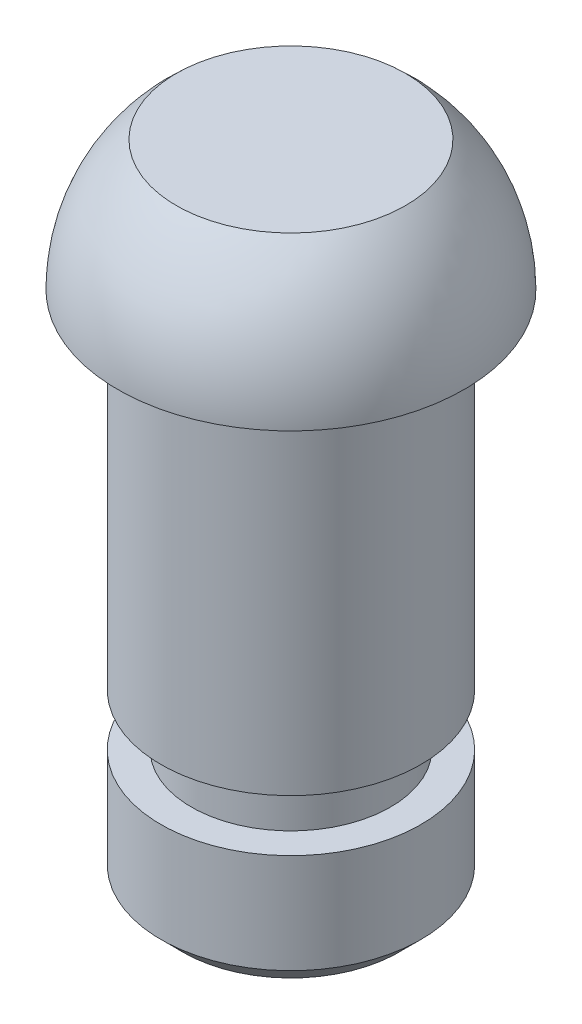
ISO-10303-21;
HEADER;
FILE_DESCRIPTION(('STEP AP214'),'2;1');
FILE_NAME('part.step','',(''),(''),'','','');
FILE_SCHEMA(('AUTOMOTIVE_DESIGN { 1 0 10303 214 1 1 1 1 }'));
ENDSEC;
DATA;
#1=APPLICATION_CONTEXT('core data for automotive mechanical design processes');
#2=APPLICATION_PROTOCOL_DEFINITION('international standard','automotive_design',2000,#1);
#3=PRODUCT_CONTEXT('',#1,'mechanical');
#4=PRODUCT('Part','Part','',(#3));
#5=PRODUCT_RELATED_PRODUCT_CATEGORY('part','',(#4));
#6=PRODUCT_DEFINITION_FORMATION('','',#4);
#7=PRODUCT_DEFINITION_CONTEXT('part definition',#1,'design');
#8=PRODUCT_DEFINITION('design','',#6,#7);
#9=PRODUCT_DEFINITION_SHAPE('','',#8);
#10=(LENGTH_UNIT() NAMED_UNIT(*) SI_UNIT(.MILLI.,.METRE.));
#11=(NAMED_UNIT(*) PLANE_ANGLE_UNIT() SI_UNIT($,.RADIAN.));
#12=(NAMED_UNIT(*) SI_UNIT($,.STERADIAN.) SOLID_ANGLE_UNIT());
#13=UNCERTAINTY_MEASURE_WITH_UNIT(LENGTH_MEASURE(1.E-05),#10,'distance_accuracy_value','');
#14=(GEOMETRIC_REPRESENTATION_CONTEXT(3) GLOBAL_UNCERTAINTY_ASSIGNED_CONTEXT((#13)) GLOBAL_UNIT_ASSIGNED_CONTEXT((#10,
#11,#12)) REPRESENTATION_CONTEXT('',''));
#15=CARTESIAN_POINT('',(0.,0.,0.));
#16=DIRECTION('',(0.,0.,1.));
#17=DIRECTION('',(1.,0.,0.));
#18=AXIS2_PLACEMENT_3D('',#15,#16,#17);
#19=CARTESIAN_POINT('',(1.5,0.,0.));
#20=DIRECTION('',(0.,-1.,0.));
#21=DIRECTION('',(0.,0.,-1.));
#22=AXIS2_PLACEMENT_3D('',#19,#20,#21);
#23=PLANE('',#22);
#24=CARTESIAN_POINT('',(0.,0.,0.));
#25=DIRECTION('',(0.,-1.,0.));
#26=DIRECTION('',(0.,0.,-1.));
#27=AXIS2_PLACEMENT_3D('',#24,#25,#26);
#28=CIRCLE('',#27,1.25);
#29=CARTESIAN_POINT('',(0.,0.,-1.25));
#30=VERTEX_POINT('',#29);
#31=EDGE_CURVE('E43',#30,#30,#28,.T.);
#32=ORIENTED_EDGE('',*,*,#31,.T.);
#33=EDGE_LOOP('',(#32));
#34=FACE_BOUND('',#33,.T.);
#35=ADVANCED_FACE('F35',(#34),#23,.T.);
#36=CARTESIAN_POINT('',(0.,0.,0.));
#37=DIRECTION('',(0.,-1.,0.));
#38=DIRECTION('',(0.,0.,-1.));
#39=AXIS2_PLACEMENT_3D('',#36,#37,#38);
#40=CYLINDRICAL_SURFACE('',#39,1.5);
#41=CARTESIAN_POINT('',(0.,0.249999999999998,0.));
#42=DIRECTION('',(0.,-1.,0.));
#43=DIRECTION('',(0.,0.,-1.));
#44=AXIS2_PLACEMENT_3D('',#41,#42,#43);
#45=CIRCLE('',#44,1.5);
#46=CARTESIAN_POINT('',(0.,0.249999999999998,-1.5));
#47=VERTEX_POINT('',#46);
#48=EDGE_CURVE('E10',#47,#47,#45,.F.);
#49=ORIENTED_EDGE('',*,*,#48,.T.);
#50=EDGE_LOOP('',(#49));
#51=FACE_BOUND('',#50,.T.);
#52=CARTESIAN_POINT('',(0.,1.4,0.));
#53=DIRECTION('',(0.,-1.,0.));
#54=DIRECTION('',(0.,0.,-1.));
#55=AXIS2_PLACEMENT_3D('',#52,#53,#54);
#56=CIRCLE('',#55,1.5);
#57=CARTESIAN_POINT('',(0.,1.4,-1.5));
#58=VERTEX_POINT('',#57);
#59=EDGE_CURVE('E47',#58,#58,#56,.T.);
#60=ORIENTED_EDGE('',*,*,#59,.T.);
#61=EDGE_LOOP('',(#60));
#62=FACE_BOUND('',#61,.T.);
#63=ADVANCED_FACE('F86',(#51,#62),#40,.T.);
#64=CARTESIAN_POINT('',(1.15,1.4,0.));
#65=DIRECTION('',(0.,1.,0.));
#66=DIRECTION('',(0.,0.,1.));
#67=AXIS2_PLACEMENT_3D('',#64,#65,#66);
#68=PLANE('',#67);
#69=CARTESIAN_POINT('',(0.,1.4,0.));
#70=DIRECTION('',(0.,-1.,0.));
#71=DIRECTION('',(0.,0.,-1.));
#72=AXIS2_PLACEMENT_3D('',#69,#70,#71);
#73=CIRCLE('',#72,1.15);
#74=CARTESIAN_POINT('',(0.,1.4,-1.15));
#75=VERTEX_POINT('',#74);
#76=EDGE_CURVE('E51',#75,#75,#73,.T.);
#77=ORIENTED_EDGE('',*,*,#76,.T.);
#78=EDGE_LOOP('',(#77));
#79=FACE_BOUND('',#78,.T.);
#80=ORIENTED_EDGE('',*,*,#59,.F.);
#81=EDGE_LOOP('',(#80));
#82=FACE_BOUND('',#81,.T.);
#83=ADVANCED_FACE('F90',(#79,#82),#68,.T.);
#84=CARTESIAN_POINT('',(0.,0.,0.));
#85=DIRECTION('',(0.,-1.,0.));
#86=DIRECTION('',(0.,0.,-1.));
#87=AXIS2_PLACEMENT_3D('',#84,#85,#86);
#88=CYLINDRICAL_SURFACE('',#87,1.15);
#89=CARTESIAN_POINT('',(0.,2.,0.));
#90=DIRECTION('',(0.,-1.,0.));
#91=DIRECTION('',(0.,0.,-1.));
#92=AXIS2_PLACEMENT_3D('',#89,#90,#91);
#93=CIRCLE('',#92,1.15);
#94=CARTESIAN_POINT('',(0.,2.,-1.15));
#95=VERTEX_POINT('',#94);
#96=EDGE_CURVE('E56',#95,#95,#93,.T.);
#97=ORIENTED_EDGE('',*,*,#96,.T.);
#98=EDGE_LOOP('',(#97));
#99=FACE_BOUND('',#98,.T.);
#100=ORIENTED_EDGE('',*,*,#76,.F.);
#101=EDGE_LOOP('',(#100));
#102=FACE_BOUND('',#101,.T.);
#103=ADVANCED_FACE('F95',(#99,#102),#88,.T.);
#104=CARTESIAN_POINT('',(1.5,2.,0.));
#105=DIRECTION('',(0.,-1.,0.));
#106=DIRECTION('',(0.,0.,-1.));
#107=AXIS2_PLACEMENT_3D('',#104,#105,#106);
#108=PLANE('',#107);
#109=CARTESIAN_POINT('',(0.,2.,0.));
#110=DIRECTION('',(0.,-1.,0.));
#111=DIRECTION('',(0.,0.,-1.));
#112=AXIS2_PLACEMENT_3D('',#109,#110,#111);
#113=CIRCLE('',#112,1.5);
#114=CARTESIAN_POINT('',(0.,2.,-1.5));
#115=VERTEX_POINT('',#114);
#116=EDGE_CURVE('E59',#115,#115,#113,.T.);
#117=ORIENTED_EDGE('',*,*,#116,.T.);
#118=EDGE_LOOP('',(#117));
#119=FACE_BOUND('',#118,.T.);
#120=ORIENTED_EDGE('',*,*,#96,.F.);
#121=EDGE_LOOP('',(#120));
#122=FACE_BOUND('',#121,.T.);
#123=ADVANCED_FACE('F99',(#119,#122),#108,.T.);
#124=CARTESIAN_POINT('',(0.,0.,0.));
#125=DIRECTION('',(0.,-1.,0.));
#126=DIRECTION('',(0.,0.,-1.));
#127=AXIS2_PLACEMENT_3D('',#124,#125,#126);
#128=CYLINDRICAL_SURFACE('',#127,1.5);
#129=CARTESIAN_POINT('',(0.,6.,0.));
#130=DIRECTION('',(0.,-1.,0.));
#131=DIRECTION('',(0.,0.,-1.));
#132=AXIS2_PLACEMENT_3D('',#129,#130,#131);
#133=CIRCLE('',#132,1.5);
#134=CARTESIAN_POINT('',(0.,6.,-1.5));
#135=VERTEX_POINT('',#134);
#136=EDGE_CURVE('E62',#135,#135,#133,.T.);
#137=ORIENTED_EDGE('',*,*,#136,.T.);
#138=EDGE_LOOP('',(#137));
#139=FACE_BOUND('',#138,.T.);
#140=ORIENTED_EDGE('',*,*,#116,.F.);
#141=EDGE_LOOP('',(#140));
#142=FACE_BOUND('',#141,.T.);
#143=ADVANCED_FACE('F103',(#139,#142),#128,.T.);
#144=CARTESIAN_POINT('',(1.5,6.,0.));
#145=DIRECTION('',(0.,-1.,0.));
#146=DIRECTION('',(0.,0.,-1.));
#147=AXIS2_PLACEMENT_3D('',#144,#145,#146);
#148=PLANE('',#147);
#149=CARTESIAN_POINT('',(0.,6.,0.));
#150=DIRECTION('',(0.,-1.,0.));
#151=DIRECTION('',(0.,0.,-1.));
#152=AXIS2_PLACEMENT_3D('',#149,#150,#151);
#153=CIRCLE('',#152,2.);
#154=CARTESIAN_POINT('',(0.,6.,-2.));
#155=VERTEX_POINT('',#154);
#156=EDGE_CURVE('E65',#155,#155,#153,.T.);
#157=ORIENTED_EDGE('',*,*,#156,.T.);
#158=EDGE_LOOP('',(#157));
#159=FACE_BOUND('',#158,.T.);
#160=ORIENTED_EDGE('',*,*,#136,.F.);
#161=EDGE_LOOP('',(#160));
#162=FACE_BOUND('',#161,.T.);
#163=ADVANCED_FACE('F83',(#159,#162),#148,.T.);
#164=CARTESIAN_POINT('',(0.,6.,0.));
#165=DIRECTION('',(0.,-1.,0.));
#166=DIRECTION('',(1.,0.,0.));
#167=AXIS2_PLACEMENT_3D('',#164,#165,#166);
#168=SPHERICAL_SURFACE('',#167,2.);
#169=CARTESIAN_POINT('',(0.,7.5,0.));
#170=DIRECTION('',(0.,-1.,0.));
#171=DIRECTION('',(0.,0.,-1.));
#172=AXIS2_PLACEMENT_3D('',#169,#170,#171);
#173=CIRCLE('',#172,1.3228756555323);
#174=CARTESIAN_POINT('',(0.,7.5,-1.3228756555323));
#175=VERTEX_POINT('',#174);
#176=EDGE_CURVE('E68',#175,#175,#173,.T.);
#177=ORIENTED_EDGE('',*,*,#176,.T.);
#178=EDGE_LOOP('',(#177));
#179=FACE_BOUND('',#178,.T.);
#180=ORIENTED_EDGE('',*,*,#156,.F.);
#181=EDGE_LOOP('',(#180));
#182=FACE_BOUND('',#181,.T.);
#183=ADVANCED_FACE('F72',(#179,#182),#168,.T.);
#184=CARTESIAN_POINT('',(0.,7.5,0.));
#185=DIRECTION('',(0.,1.,0.));
#186=DIRECTION('',(0.,0.,1.));
#187=AXIS2_PLACEMENT_3D('',#184,#185,#186);
#188=PLANE('',#187);
#189=ORIENTED_EDGE('',*,*,#176,.F.);
#190=EDGE_LOOP('',(#189));
#191=FACE_BOUND('',#190,.T.);
#192=ADVANCED_FACE('F75',(#191),#188,.T.);
#193=CARTESIAN_POINT('',(0.,0.,0.));
#194=DIRECTION('',(0.,1.,0.));
#195=DIRECTION('',(0.,0.,1.));
#196=AXIS2_PLACEMENT_3D('',#193,#194,#195);
#197=CONICAL_SURFACE('',#196,1.25,0.785398163397447);
#198=ORIENTED_EDGE('',*,*,#48,.F.);
#199=EDGE_LOOP('',(#198));
#200=FACE_BOUND('',#199,.T.);
#201=ORIENTED_EDGE('',*,*,#31,.F.);
#202=EDGE_LOOP('',(#201));
#203=FACE_BOUND('',#202,.T.);
#204=ADVANCED_FACE('F38',(#200,#203),#197,.T.);
#205=CLOSED_SHELL('',(#35,#63,#83,#103,#123,#143,#163,#183,#192,#204));
#206=MANIFOLD_SOLID_BREP('B2',#205);
#207=ADVANCED_BREP_SHAPE_REPRESENTATION('',(#18,#206),#14);
#208=SHAPE_DEFINITION_REPRESENTATION(#9,#207);
ENDSEC;
END-ISO-10303-21;
